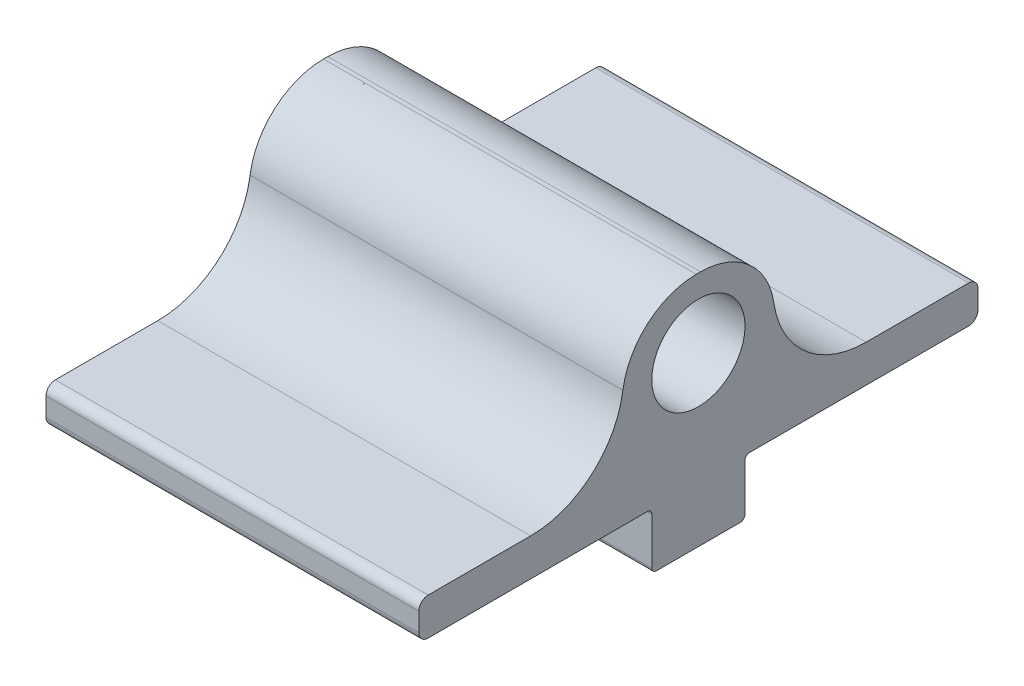
ISO-10303-21;
HEADER;
FILE_DESCRIPTION(('STEP AP214'),'2;1');
FILE_NAME('part.step','',(''),(''),'','','');
FILE_SCHEMA(('AUTOMOTIVE_DESIGN { 1 0 10303 214 1 1 1 1 }'));
ENDSEC;
DATA;
#1=APPLICATION_CONTEXT('core data for automotive mechanical design processes');
#2=APPLICATION_PROTOCOL_DEFINITION('international standard','automotive_design',2000,#1);
#3=PRODUCT_CONTEXT('',#1,'mechanical');
#4=PRODUCT('Part','Part','',(#3));
#5=PRODUCT_RELATED_PRODUCT_CATEGORY('part','',(#4));
#6=PRODUCT_DEFINITION_FORMATION('','',#4);
#7=PRODUCT_DEFINITION_CONTEXT('part definition',#1,'design');
#8=PRODUCT_DEFINITION('design','',#6,#7);
#9=PRODUCT_DEFINITION_SHAPE('','',#8);
#10=(LENGTH_UNIT() NAMED_UNIT(*) SI_UNIT(.MILLI.,.METRE.));
#11=(NAMED_UNIT(*) PLANE_ANGLE_UNIT() SI_UNIT($,.RADIAN.));
#12=(NAMED_UNIT(*) SI_UNIT($,.STERADIAN.) SOLID_ANGLE_UNIT());
#13=UNCERTAINTY_MEASURE_WITH_UNIT(LENGTH_MEASURE(1.E-05),#10,'distance_accuracy_value','');
#14=(GEOMETRIC_REPRESENTATION_CONTEXT(3) GLOBAL_UNCERTAINTY_ASSIGNED_CONTEXT((#13)) GLOBAL_UNIT_ASSIGNED_CONTEXT((#10,
#11,#12)) REPRESENTATION_CONTEXT('',''));
#15=CARTESIAN_POINT('',(0.,0.,0.));
#16=DIRECTION('',(0.,0.,1.));
#17=DIRECTION('',(1.,0.,0.));
#18=AXIS2_PLACEMENT_3D('',#15,#16,#17);
#19=CARTESIAN_POINT('',(20.,29.,30.));
#20=DIRECTION('',(-1.,0.,0.));
#21=DIRECTION('',(0.,0.,1.));
#22=AXIS2_PLACEMENT_3D('',#19,#20,#21);
#23=PLANE('',#22);
#24=CARTESIAN_POINT('',(20.,17.,0.));
#25=DIRECTION('',(-1.,0.,0.));
#26=DIRECTION('',(0.,0.,1.));
#27=AXIS2_PLACEMENT_3D('',#24,#25,#26);
#28=CIRCLE('',#27,5.);
#29=CARTESIAN_POINT('',(20.,17.,5.));
#30=VERTEX_POINT('',#29);
#31=EDGE_CURVE('E518',#30,#30,#28,.T.);
#32=ORIENTED_EDGE('',*,*,#31,.T.);
#33=EDGE_LOOP('',(#32));
#34=FACE_BOUND('',#33,.T.);
#35=DIRECTION('',(0.,0.,1.));
#36=VECTOR('',#35,1.);
#37=CARTESIAN_POINT('',(20.,-1.,-5.));
#38=LINE('',#37,#36);
#39=CARTESIAN_POINT('',(20.,-1.,-4.5));
#40=VERTEX_POINT('',#39);
#41=CARTESIAN_POINT('',(20.,-1.,4.5));
#42=VERTEX_POINT('',#41);
#43=EDGE_CURVE('E424',#40,#42,#38,.T.);
#44=ORIENTED_EDGE('',*,*,#43,.F.);
#45=CARTESIAN_POINT('',(20.,-0.5,-4.5));
#46=DIRECTION('',(-1.,0.,0.));
#47=DIRECTION('',(0.,0.,1.));
#48=AXIS2_PLACEMENT_3D('',#45,#46,#47);
#49=CIRCLE('',#48,0.5);
#50=CARTESIAN_POINT('',(20.,-0.5,-5.));
#51=VERTEX_POINT('',#50);
#52=EDGE_CURVE('E338',#40,#51,#49,.F.);
#53=ORIENTED_EDGE('',*,*,#52,.T.);
#54=DIRECTION('',(0.,1.,0.));
#55=VECTOR('',#54,1.);
#56=CARTESIAN_POINT('',(20.,-1.,-5.));
#57=LINE('',#56,#55);
#58=CARTESIAN_POINT('',(20.,4.5,-5.));
#59=VERTEX_POINT('',#58);
#60=EDGE_CURVE('E379',#51,#59,#57,.T.);
#61=ORIENTED_EDGE('',*,*,#60,.T.);
#62=CARTESIAN_POINT('',(20.,4.5,-5.5));
#63=DIRECTION('',(-1.,0.,0.));
#64=DIRECTION('',(0.,0.,1.));
#65=AXIS2_PLACEMENT_3D('',#62,#63,#64);
#66=CIRCLE('',#65,0.5);
#67=CARTESIAN_POINT('',(20.,5.,-5.5));
#68=VERTEX_POINT('',#67);
#69=EDGE_CURVE('E356',#59,#68,#66,.T.);
#70=ORIENTED_EDGE('',*,*,#69,.T.);
#71=DIRECTION('',(0.,0.,-1.));
#72=VECTOR('',#71,1.);
#73=CARTESIAN_POINT('',(20.,5.,30.));
#74=LINE('',#73,#72);
#75=CARTESIAN_POINT('',(20.,5.,-29.));
#76=VERTEX_POINT('',#75);
#77=EDGE_CURVE('E385',#68,#76,#74,.T.);
#78=ORIENTED_EDGE('',*,*,#77,.T.);
#79=CARTESIAN_POINT('',(20.,6.,-29.));
#80=DIRECTION('',(-1.,0.,0.));
#81=DIRECTION('',(0.,0.,1.));
#82=AXIS2_PLACEMENT_3D('',#79,#80,#81);
#83=CIRCLE('',#82,1.);
#84=CARTESIAN_POINT('',(20.,6.,-30.));
#85=VERTEX_POINT('',#84);
#86=EDGE_CURVE('E272',#76,#85,#83,.F.);
#87=ORIENTED_EDGE('',*,*,#86,.T.);
#88=DIRECTION('',(0.,-1.,0.));
#89=VECTOR('',#88,1.);
#90=CARTESIAN_POINT('',(20.,29.,-30.));
#91=LINE('',#90,#89);
#92=CARTESIAN_POINT('',(20.,8.,-30.));
#93=VERTEX_POINT('',#92);
#94=EDGE_CURVE('E220',#93,#85,#91,.T.);
#95=ORIENTED_EDGE('',*,*,#94,.F.);
#96=CARTESIAN_POINT('',(20.,8.,-29.));
#97=DIRECTION('',(-1.,0.,0.));
#98=DIRECTION('',(0.,0.,1.));
#99=AXIS2_PLACEMENT_3D('',#96,#97,#98);
#100=CIRCLE('',#99,1.);
#101=CARTESIAN_POINT('',(20.,9.,-29.));
#102=VERTEX_POINT('',#101);
#103=EDGE_CURVE('E269',#93,#102,#100,.F.);
#104=ORIENTED_EDGE('',*,*,#103,.T.);
#105=DIRECTION('',(0.,0.,1.));
#106=VECTOR('',#105,1.);
#107=CARTESIAN_POINT('',(20.,9.,30.));
#108=LINE('',#107,#106);
#109=CARTESIAN_POINT('',(20.,9.,-18.));
#110=VERTEX_POINT('',#109);
#111=EDGE_CURVE('E422',#102,#110,#108,.T.);
#112=ORIENTED_EDGE('',*,*,#111,.T.);
#113=CARTESIAN_POINT('',(20.,19.,-18.));
#114=DIRECTION('',(-1.,0.,0.));
#115=DIRECTION('',(0.,0.,1.));
#116=AXIS2_PLACEMENT_3D('',#113,#114,#115);
#117=CIRCLE('',#116,10.);
#118=CARTESIAN_POINT('',(20.,17.5699498710105,-8.10278035867763));
#119=VERTEX_POINT('',#118);
#120=EDGE_CURVE('E201',#110,#119,#117,.T.);
#121=ORIENTED_EDGE('',*,*,#120,.T.);
#122=CARTESIAN_POINT('',(20.,16.425909767819,-0.185004645619741));
#123=DIRECTION('',(-1.,0.,0.));
#124=DIRECTION('',(0.,0.,1.));
#125=AXIS2_PLACEMENT_3D('',#122,#123,#124);
#126=CIRCLE('',#125,8.);
#127=CARTESIAN_POINT('',(20.,24.4257942510587,-0.227995979873574));
#128=VERTEX_POINT('',#127);
#129=EDGE_CURVE('E310',#119,#128,#126,.F.);
#130=ORIENTED_EDGE('',*,*,#129,.T.);
#131=CARTESIAN_POINT('',(20.,-18.,0.));
#132=DIRECTION('',(-1.,0.,0.));
#133=DIRECTION('',(0.,0.,1.));
#134=AXIS2_PLACEMENT_3D('',#131,#132,#133);
#135=CIRCLE('',#134,42.4264068711928);
#136=CARTESIAN_POINT('',(20.,24.4257942510587,0.227995979873576));
#137=VERTEX_POINT('',#136);
#138=EDGE_CURVE('E398',#137,#128,#135,.T.);
#139=ORIENTED_EDGE('',*,*,#138,.F.);
#140=CARTESIAN_POINT('',(20.,16.425909767819,0.185004645619742));
#141=DIRECTION('',(-1.,0.,0.));
#142=DIRECTION('',(0.,0.,1.));
#143=AXIS2_PLACEMENT_3D('',#140,#141,#142);
#144=CIRCLE('',#143,8.);
#145=CARTESIAN_POINT('',(20.,17.5699498710105,8.10278035867763));
#146=VERTEX_POINT('',#145);
#147=EDGE_CURVE('E307',#137,#146,#144,.F.);
#148=ORIENTED_EDGE('',*,*,#147,.T.);
#149=CARTESIAN_POINT('',(20.,19.,18.));
#150=DIRECTION('',(-1.,0.,0.));
#151=DIRECTION('',(0.,0.,1.));
#152=AXIS2_PLACEMENT_3D('',#149,#150,#151);
#153=CIRCLE('',#152,10.);
#154=CARTESIAN_POINT('',(20.,9.,18.));
#155=VERTEX_POINT('',#154);
#156=EDGE_CURVE('E237',#146,#155,#153,.T.);
#157=ORIENTED_EDGE('',*,*,#156,.T.);
#158=DIRECTION('',(0.,0.,-1.));
#159=VECTOR('',#158,1.);
#160=CARTESIAN_POINT('',(20.,8.99999999999999,30.));
#161=LINE('',#160,#159);
#162=CARTESIAN_POINT('',(20.,8.99999999999999,29.));
#163=VERTEX_POINT('',#162);
#164=EDGE_CURVE('E214',#163,#155,#161,.T.);
#165=ORIENTED_EDGE('',*,*,#164,.F.);
#166=CARTESIAN_POINT('',(20.,7.99999999999999,29.));
#167=DIRECTION('',(-1.,0.,0.));
#168=DIRECTION('',(0.,0.,1.));
#169=AXIS2_PLACEMENT_3D('',#166,#167,#168);
#170=CIRCLE('',#169,1.);
#171=CARTESIAN_POINT('',(20.,7.99999999999999,30.));
#172=VERTEX_POINT('',#171);
#173=EDGE_CURVE('E263',#163,#172,#170,.F.);
#174=ORIENTED_EDGE('',*,*,#173,.T.);
#175=DIRECTION('',(0.,-1.,0.));
#176=VECTOR('',#175,1.);
#177=CARTESIAN_POINT('',(20.,29.,30.));
#178=LINE('',#177,#176);
#179=CARTESIAN_POINT('',(20.,6.,30.));
#180=VERTEX_POINT('',#179);
#181=EDGE_CURVE('E404',#172,#180,#178,.T.);
#182=ORIENTED_EDGE('',*,*,#181,.T.);
#183=CARTESIAN_POINT('',(20.,6.,29.));
#184=DIRECTION('',(-1.,0.,0.));
#185=DIRECTION('',(0.,0.,1.));
#186=AXIS2_PLACEMENT_3D('',#183,#184,#185);
#187=CIRCLE('',#186,1.);
#188=CARTESIAN_POINT('',(20.,5.,29.));
#189=VERTEX_POINT('',#188);
#190=EDGE_CURVE('E266',#180,#189,#187,.F.);
#191=ORIENTED_EDGE('',*,*,#190,.T.);
#192=CARTESIAN_POINT('',(20.,5.,5.5));
#193=VERTEX_POINT('',#192);
#194=EDGE_CURVE('E391',#189,#193,#74,.T.);
#195=ORIENTED_EDGE('',*,*,#194,.T.);
#196=CARTESIAN_POINT('',(20.,4.5,5.5));
#197=DIRECTION('',(-1.,0.,0.));
#198=DIRECTION('',(0.,0.,1.));
#199=AXIS2_PLACEMENT_3D('',#196,#197,#198);
#200=CIRCLE('',#199,0.5);
#201=CARTESIAN_POINT('',(20.,4.5,5.));
#202=VERTEX_POINT('',#201);
#203=EDGE_CURVE('E11',#193,#202,#200,.T.);
#204=ORIENTED_EDGE('',*,*,#203,.T.);
#205=DIRECTION('',(0.,1.,0.));
#206=VECTOR('',#205,1.);
#207=CARTESIAN_POINT('',(20.,-1.,5.));
#208=LINE('',#207,#206);
#209=CARTESIAN_POINT('',(20.,-0.5,5.));
#210=VERTEX_POINT('',#209);
#211=EDGE_CURVE('E442',#210,#202,#208,.T.);
#212=ORIENTED_EDGE('',*,*,#211,.F.);
#213=CARTESIAN_POINT('',(20.,-0.5,4.5));
#214=DIRECTION('',(-1.,0.,0.));
#215=DIRECTION('',(0.,0.,1.));
#216=AXIS2_PLACEMENT_3D('',#213,#214,#215);
#217=CIRCLE('',#216,0.5);
#218=EDGE_CURVE('E335',#210,#42,#217,.F.);
#219=ORIENTED_EDGE('',*,*,#218,.T.);
#220=EDGE_LOOP('',(#44,#53,#61,#70,#78,#87,#95,#104,#112,#121,#130,#139,#148,#157,#165,#174,
#182,#191,#195,#204,#212,#219));
#221=FACE_BOUND('',#220,.T.);
#222=ADVANCED_FACE('F43',(#34,#221),#23,.F.);
#223=CARTESIAN_POINT('',(-20.,29.,30.));
#224=DIRECTION('',(1.,0.,0.));
#225=DIRECTION('',(0.,0.,-1.));
#226=AXIS2_PLACEMENT_3D('',#223,#224,#225);
#227=PLANE('',#226);
#228=CARTESIAN_POINT('',(-20.,17.,0.));
#229=DIRECTION('',(1.,0.,0.));
#230=DIRECTION('',(0.,0.,-1.));
#231=AXIS2_PLACEMENT_3D('',#228,#229,#230);
#232=CIRCLE('',#231,5.);
#233=CARTESIAN_POINT('',(-20.,17.,-5.));
#234=VERTEX_POINT('',#233);
#235=EDGE_CURVE('E520',#234,#234,#232,.T.);
#236=ORIENTED_EDGE('',*,*,#235,.T.);
#237=EDGE_LOOP('',(#236));
#238=FACE_BOUND('',#237,.T.);
#239=DIRECTION('',(0.,1.,0.));
#240=VECTOR('',#239,1.);
#241=CARTESIAN_POINT('',(-20.,-1.,-5.));
#242=LINE('',#241,#240);
#243=CARTESIAN_POINT('',(-20.,-0.5,-5.));
#244=VERTEX_POINT('',#243);
#245=CARTESIAN_POINT('',(-20.,4.5,-5.));
#246=VERTEX_POINT('',#245);
#247=EDGE_CURVE('E365',#244,#246,#242,.T.);
#248=ORIENTED_EDGE('',*,*,#247,.F.);
#249=CARTESIAN_POINT('',(-20.,-0.5,-4.5));
#250=DIRECTION('',(1.,0.,0.));
#251=DIRECTION('',(0.,0.,-1.));
#252=AXIS2_PLACEMENT_3D('',#249,#250,#251);
#253=CIRCLE('',#252,0.5);
#254=CARTESIAN_POINT('',(-20.,-1.,-4.5));
#255=VERTEX_POINT('',#254);
#256=EDGE_CURVE('E344',#244,#255,#253,.F.);
#257=ORIENTED_EDGE('',*,*,#256,.T.);
#258=DIRECTION('',(0.,0.,-1.));
#259=VECTOR('',#258,1.);
#260=CARTESIAN_POINT('',(-20.,-1.,-5.));
#261=LINE('',#260,#259);
#262=CARTESIAN_POINT('',(-20.,-1.,4.5));
#263=VERTEX_POINT('',#262);
#264=EDGE_CURVE('E429',#263,#255,#261,.T.);
#265=ORIENTED_EDGE('',*,*,#264,.F.);
#266=CARTESIAN_POINT('',(-20.,-0.5,4.5));
#267=DIRECTION('',(1.,0.,0.));
#268=DIRECTION('',(0.,0.,-1.));
#269=AXIS2_PLACEMENT_3D('',#266,#267,#268);
#270=CIRCLE('',#269,0.5);
#271=CARTESIAN_POINT('',(-20.,-0.5,5.));
#272=VERTEX_POINT('',#271);
#273=EDGE_CURVE('E341',#263,#272,#270,.F.);
#274=ORIENTED_EDGE('',*,*,#273,.T.);
#275=DIRECTION('',(0.,1.,0.));
#276=VECTOR('',#275,1.);
#277=CARTESIAN_POINT('',(-20.,-1.,5.));
#278=LINE('',#277,#276);
#279=CARTESIAN_POINT('',(-20.,4.5,5.));
#280=VERTEX_POINT('',#279);
#281=EDGE_CURVE('E378',#272,#280,#278,.T.);
#282=ORIENTED_EDGE('',*,*,#281,.T.);
#283=CARTESIAN_POINT('',(-20.,4.5,5.5));
#284=DIRECTION('',(1.,0.,0.));
#285=DIRECTION('',(0.,0.,-1.));
#286=AXIS2_PLACEMENT_3D('',#283,#284,#285);
#287=CIRCLE('',#286,0.5);
#288=CARTESIAN_POINT('',(-20.,5.,5.5));
#289=VERTEX_POINT('',#288);
#290=EDGE_CURVE('E52',#280,#289,#287,.T.);
#291=ORIENTED_EDGE('',*,*,#290,.T.);
#292=DIRECTION('',(0.,0.,1.));
#293=VECTOR('',#292,1.);
#294=CARTESIAN_POINT('',(-20.,5.,30.));
#295=LINE('',#294,#293);
#296=CARTESIAN_POINT('',(-20.,5.,29.));
#297=VERTEX_POINT('',#296);
#298=EDGE_CURVE('E397',#289,#297,#295,.T.);
#299=ORIENTED_EDGE('',*,*,#298,.T.);
#300=CARTESIAN_POINT('',(-20.,6.,29.));
#301=DIRECTION('',(1.,0.,0.));
#302=DIRECTION('',(0.,0.,-1.));
#303=AXIS2_PLACEMENT_3D('',#300,#301,#302);
#304=CIRCLE('',#303,1.);
#305=CARTESIAN_POINT('',(-20.,6.,30.));
#306=VERTEX_POINT('',#305);
#307=EDGE_CURVE('E250',#297,#306,#304,.F.);
#308=ORIENTED_EDGE('',*,*,#307,.T.);
#309=DIRECTION('',(0.,-1.,0.));
#310=VECTOR('',#309,1.);
#311=CARTESIAN_POINT('',(-20.,29.,30.));
#312=LINE('',#311,#310);
#313=CARTESIAN_POINT('',(-20.,7.99999999999999,30.));
#314=VERTEX_POINT('',#313);
#315=EDGE_CURVE('E408',#314,#306,#312,.T.);
#316=ORIENTED_EDGE('',*,*,#315,.F.);
#317=CARTESIAN_POINT('',(-20.,7.99999999999999,29.));
#318=DIRECTION('',(1.,0.,0.));
#319=DIRECTION('',(0.,0.,-1.));
#320=AXIS2_PLACEMENT_3D('',#317,#318,#319);
#321=CIRCLE('',#320,1.);
#322=CARTESIAN_POINT('',(-20.,8.99999999999999,29.));
#323=VERTEX_POINT('',#322);
#324=EDGE_CURVE('E247',#314,#323,#321,.F.);
#325=ORIENTED_EDGE('',*,*,#324,.T.);
#326=DIRECTION('',(0.,0.,-1.));
#327=VECTOR('',#326,1.);
#328=CARTESIAN_POINT('',(-20.,9.,0.));
#329=LINE('',#328,#327);
#330=CARTESIAN_POINT('',(-20.,9.,18.));
#331=VERTEX_POINT('',#330);
#332=EDGE_CURVE('E215',#323,#331,#329,.T.);
#333=ORIENTED_EDGE('',*,*,#332,.T.);
#334=CARTESIAN_POINT('',(-20.,19.,18.));
#335=DIRECTION('',(1.,0.,0.));
#336=DIRECTION('',(0.,0.,-1.));
#337=AXIS2_PLACEMENT_3D('',#334,#335,#336);
#338=CIRCLE('',#337,10.);
#339=CARTESIAN_POINT('',(-20.,17.5699498710105,8.10278035867763));
#340=VERTEX_POINT('',#339);
#341=EDGE_CURVE('E233',#331,#340,#338,.T.);
#342=ORIENTED_EDGE('',*,*,#341,.T.);
#343=CARTESIAN_POINT('',(-20.,16.425909767819,0.185004645619742));
#344=DIRECTION('',(1.,0.,0.));
#345=DIRECTION('',(0.,0.,-1.));
#346=AXIS2_PLACEMENT_3D('',#343,#344,#345);
#347=CIRCLE('',#346,8.);
#348=CARTESIAN_POINT('',(-20.,24.4257942510587,0.227995979873576));
#349=VERTEX_POINT('',#348);
#350=EDGE_CURVE('E299',#340,#349,#347,.F.);
#351=ORIENTED_EDGE('',*,*,#350,.T.);
#352=CARTESIAN_POINT('',(-20.,-18.,0.));
#353=DIRECTION('',(1.,0.,0.));
#354=DIRECTION('',(0.,0.,-1.));
#355=AXIS2_PLACEMENT_3D('',#352,#353,#354);
#356=CIRCLE('',#355,42.4264068711928);
#357=CARTESIAN_POINT('',(-20.,24.4257942510587,-0.227995979873574));
#358=VERTEX_POINT('',#357);
#359=EDGE_CURVE('E392',#349,#358,#356,.F.);
#360=ORIENTED_EDGE('',*,*,#359,.T.);
#361=CARTESIAN_POINT('',(-20.,16.425909767819,-0.185004645619741));
#362=DIRECTION('',(1.,0.,0.));
#363=DIRECTION('',(0.,0.,-1.));
#364=AXIS2_PLACEMENT_3D('',#361,#362,#363);
#365=CIRCLE('',#364,8.);
#366=CARTESIAN_POINT('',(-20.,17.5699498710105,-8.10278035867763));
#367=VERTEX_POINT('',#366);
#368=EDGE_CURVE('E196',#358,#367,#365,.F.);
#369=ORIENTED_EDGE('',*,*,#368,.T.);
#370=CARTESIAN_POINT('',(-20.,19.,-18.));
#371=DIRECTION('',(1.,0.,0.));
#372=DIRECTION('',(0.,0.,-1.));
#373=AXIS2_PLACEMENT_3D('',#370,#371,#372);
#374=CIRCLE('',#373,10.);
#375=CARTESIAN_POINT('',(-20.,9.,-18.));
#376=VERTEX_POINT('',#375);
#377=EDGE_CURVE('E190',#367,#376,#374,.T.);
#378=ORIENTED_EDGE('',*,*,#377,.T.);
#379=DIRECTION('',(0.,0.,1.));
#380=VECTOR('',#379,1.);
#381=CARTESIAN_POINT('',(-20.,9.,0.));
#382=LINE('',#381,#380);
#383=CARTESIAN_POINT('',(-20.,9.,-29.));
#384=VERTEX_POINT('',#383);
#385=EDGE_CURVE('E194',#384,#376,#382,.T.);
#386=ORIENTED_EDGE('',*,*,#385,.F.);
#387=CARTESIAN_POINT('',(-20.,8.,-29.));
#388=DIRECTION('',(1.,0.,0.));
#389=DIRECTION('',(0.,0.,-1.));
#390=AXIS2_PLACEMENT_3D('',#387,#388,#389);
#391=CIRCLE('',#390,1.);
#392=CARTESIAN_POINT('',(-20.,8.,-30.));
#393=VERTEX_POINT('',#392);
#394=EDGE_CURVE('E253',#384,#393,#391,.F.);
#395=ORIENTED_EDGE('',*,*,#394,.T.);
#396=DIRECTION('',(0.,-1.,0.));
#397=VECTOR('',#396,1.);
#398=CARTESIAN_POINT('',(-20.,29.,-30.));
#399=LINE('',#398,#397);
#400=CARTESIAN_POINT('',(-20.,6.,-30.));
#401=VERTEX_POINT('',#400);
#402=EDGE_CURVE('E227',#393,#401,#399,.T.);
#403=ORIENTED_EDGE('',*,*,#402,.T.);
#404=CARTESIAN_POINT('',(-20.,6.,-29.));
#405=DIRECTION('',(1.,0.,0.));
#406=DIRECTION('',(0.,0.,-1.));
#407=AXIS2_PLACEMENT_3D('',#404,#405,#406);
#408=CIRCLE('',#407,1.);
#409=CARTESIAN_POINT('',(-20.,5.,-29.));
#410=VERTEX_POINT('',#409);
#411=EDGE_CURVE('E256',#401,#410,#408,.F.);
#412=ORIENTED_EDGE('',*,*,#411,.T.);
#413=CARTESIAN_POINT('',(-20.,5.,-5.5));
#414=VERTEX_POINT('',#413);
#415=EDGE_CURVE('E368',#410,#414,#295,.T.);
#416=ORIENTED_EDGE('',*,*,#415,.T.);
#417=CARTESIAN_POINT('',(-20.,4.5,-5.5));
#418=DIRECTION('',(1.,0.,0.));
#419=DIRECTION('',(0.,0.,-1.));
#420=AXIS2_PLACEMENT_3D('',#417,#418,#419);
#421=CIRCLE('',#420,0.5);
#422=EDGE_CURVE('E359',#414,#246,#421,.T.);
#423=ORIENTED_EDGE('',*,*,#422,.T.);
#424=EDGE_LOOP('',(#248,#257,#265,#274,#282,#291,#299,#308,#316,#325,#333,#342,#351,#360,#369,
#378,#386,#395,#403,#412,#416,#423));
#425=FACE_BOUND('',#424,.T.);
#426=ADVANCED_FACE('F193',(#238,#425),#227,.F.);
#427=CARTESIAN_POINT('',(-20.,29.,30.));
#428=DIRECTION('',(0.,0.,-1.));
#429=DIRECTION('',(-1.,0.,0.));
#430=AXIS2_PLACEMENT_3D('',#427,#428,#429);
#431=PLANE('',#430);
#432=ORIENTED_EDGE('',*,*,#315,.T.);
#433=DIRECTION('',(1.,0.,0.));
#434=VECTOR('',#433,1.);
#435=CARTESIAN_POINT('',(-20.,6.,30.));
#436=LINE('',#435,#434);
#437=EDGE_CURVE('E281',#306,#180,#436,.T.);
#438=ORIENTED_EDGE('',*,*,#437,.T.);
#439=ORIENTED_EDGE('',*,*,#181,.F.);
#440=DIRECTION('',(-1.,0.,0.));
#441=VECTOR('',#440,1.);
#442=CARTESIAN_POINT('',(-20.,7.99999999999999,30.));
#443=LINE('',#442,#441);
#444=EDGE_CURVE('E277',#172,#314,#443,.T.);
#445=ORIENTED_EDGE('',*,*,#444,.T.);
#446=EDGE_LOOP('',(#432,#438,#439,#445));
#447=FACE_BOUND('',#446,.T.);
#448=ADVANCED_FACE('F477',(#447),#431,.F.);
#449=CARTESIAN_POINT('',(-40.,-18.,0.));
#450=DIRECTION('',(1.,0.,0.));
#451=DIRECTION('',(0.,0.,-1.));
#452=AXIS2_PLACEMENT_3D('',#449,#450,#451);
#453=CYLINDRICAL_SURFACE('',#452,42.4264068711928);
#454=ORIENTED_EDGE('',*,*,#138,.T.);
#455=DIRECTION('',(1.,0.,0.));
#456=VECTOR('',#455,1.);
#457=CARTESIAN_POINT('',(-40.,24.4257942510587,-0.227995979873574));
#458=LINE('',#457,#456);
#459=EDGE_CURVE('E295',#128,#358,#458,.F.);
#460=ORIENTED_EDGE('',*,*,#459,.T.);
#461=ORIENTED_EDGE('',*,*,#359,.F.);
#462=DIRECTION('',(1.,0.,0.));
#463=VECTOR('',#462,1.);
#464=CARTESIAN_POINT('',(-40.,24.4257942510587,0.227995979873576));
#465=LINE('',#464,#463);
#466=EDGE_CURVE('E292',#349,#137,#465,.T.);
#467=ORIENTED_EDGE('',*,*,#466,.T.);
#468=EDGE_LOOP('',(#454,#460,#461,#467));
#469=FACE_BOUND('',#468,.T.);
#470=ADVANCED_FACE('F450',(#469),#453,.T.);
#471=CARTESIAN_POINT('',(40.,5.,55.));
#472=DIRECTION('',(0.,1.,0.));
#473=DIRECTION('',(0.,0.,1.));
#474=AXIS2_PLACEMENT_3D('',#471,#472,#473);
#475=PLANE('',#474);
#476=ORIENTED_EDGE('',*,*,#77,.F.);
#477=DIRECTION('',(1.,0.,0.));
#478=VECTOR('',#477,1.);
#479=CARTESIAN_POINT('',(-20.,5.,-5.5));
#480=LINE('',#479,#478);
#481=EDGE_CURVE('E324',#68,#414,#480,.F.);
#482=ORIENTED_EDGE('',*,*,#481,.T.);
#483=ORIENTED_EDGE('',*,*,#415,.F.);
#484=DIRECTION('',(-1.,0.,0.));
#485=VECTOR('',#484,1.);
#486=CARTESIAN_POINT('',(40.,5.,-29.));
#487=LINE('',#486,#485);
#488=EDGE_CURVE('E259',#410,#76,#487,.F.);
#489=ORIENTED_EDGE('',*,*,#488,.T.);
#490=EDGE_LOOP('',(#476,#482,#483,#489));
#491=FACE_BOUND('',#490,.T.);
#492=ADVANCED_FACE('F387',(#491),#475,.F.);
#493=ORIENTED_EDGE('',*,*,#298,.F.);
#494=DIRECTION('',(-1.,0.,0.));
#495=VECTOR('',#494,1.);
#496=CARTESIAN_POINT('',(20.,5.,5.5));
#497=LINE('',#496,#495);
#498=EDGE_CURVE('E353',#289,#193,#497,.F.);
#499=ORIENTED_EDGE('',*,*,#498,.T.);
#500=ORIENTED_EDGE('',*,*,#194,.F.);
#501=DIRECTION('',(1.,0.,0.));
#502=VECTOR('',#501,1.);
#503=CARTESIAN_POINT('',(40.,5.,29.));
#504=LINE('',#503,#502);
#505=EDGE_CURVE('E285',#189,#297,#504,.F.);
#506=ORIENTED_EDGE('',*,*,#505,.T.);
#507=EDGE_LOOP('',(#493,#499,#500,#506));
#508=FACE_BOUND('',#507,.T.);
#509=ADVANCED_FACE('F485',(#508),#475,.F.);
#510=CARTESIAN_POINT('',(-20.,29.,-30.));
#511=DIRECTION('',(0.,0.,1.));
#512=DIRECTION('',(1.,0.,0.));
#513=AXIS2_PLACEMENT_3D('',#510,#511,#512);
#514=PLANE('',#513);
#515=ORIENTED_EDGE('',*,*,#94,.T.);
#516=DIRECTION('',(-1.,0.,0.));
#517=VECTOR('',#516,1.);
#518=CARTESIAN_POINT('',(-20.,6.,-30.));
#519=LINE('',#518,#517);
#520=EDGE_CURVE('E243',#85,#401,#519,.T.);
#521=ORIENTED_EDGE('',*,*,#520,.T.);
#522=ORIENTED_EDGE('',*,*,#402,.F.);
#523=DIRECTION('',(-1.,0.,0.));
#524=VECTOR('',#523,1.);
#525=CARTESIAN_POINT('',(-20.,8.,-30.));
#526=LINE('',#525,#524);
#527=EDGE_CURVE('E240',#393,#93,#526,.F.);
#528=ORIENTED_EDGE('',*,*,#527,.T.);
#529=EDGE_LOOP('',(#515,#521,#522,#528));
#530=FACE_BOUND('',#529,.T.);
#531=ADVANCED_FACE('F416',(#530),#514,.F.);
#532=CARTESIAN_POINT('',(-20.,-1.,5.));
#533=DIRECTION('',(0.,0.,-1.));
#534=DIRECTION('',(-1.,0.,0.));
#535=AXIS2_PLACEMENT_3D('',#532,#533,#534);
#536=PLANE('',#535);
#537=ORIENTED_EDGE('',*,*,#281,.F.);
#538=DIRECTION('',(-1.,0.,0.));
#539=VECTOR('',#538,1.);
#540=CARTESIAN_POINT('',(-20.,-0.5,5.));
#541=LINE('',#540,#539);
#542=EDGE_CURVE('E350',#272,#210,#541,.F.);
#543=ORIENTED_EDGE('',*,*,#542,.T.);
#544=ORIENTED_EDGE('',*,*,#211,.T.);
#545=DIRECTION('',(-1.,0.,0.));
#546=VECTOR('',#545,1.);
#547=CARTESIAN_POINT('',(-20.,4.5,5.));
#548=LINE('',#547,#546);
#549=EDGE_CURVE('E347',#202,#280,#548,.T.);
#550=ORIENTED_EDGE('',*,*,#549,.T.);
#551=EDGE_LOOP('',(#537,#543,#544,#550));
#552=FACE_BOUND('',#551,.T.);
#553=ADVANCED_FACE('F547',(#552),#536,.F.);
#554=CARTESIAN_POINT('',(-20.,-1.,-5.));
#555=DIRECTION('',(0.,0.,1.));
#556=DIRECTION('',(1.,0.,0.));
#557=AXIS2_PLACEMENT_3D('',#554,#555,#556);
#558=PLANE('',#557);
#559=ORIENTED_EDGE('',*,*,#247,.T.);
#560=DIRECTION('',(1.,0.,0.));
#561=VECTOR('',#560,1.);
#562=CARTESIAN_POINT('',(20.,4.5,-5.));
#563=LINE('',#562,#561);
#564=EDGE_CURVE('E320',#246,#59,#563,.T.);
#565=ORIENTED_EDGE('',*,*,#564,.T.);
#566=ORIENTED_EDGE('',*,*,#60,.F.);
#567=DIRECTION('',(1.,0.,0.));
#568=VECTOR('',#567,1.);
#569=CARTESIAN_POINT('',(-20.,-0.5,-5.));
#570=LINE('',#569,#568);
#571=EDGE_CURVE('E317',#51,#244,#570,.F.);
#572=ORIENTED_EDGE('',*,*,#571,.T.);
#573=EDGE_LOOP('',(#559,#565,#566,#572));
#574=FACE_BOUND('',#573,.T.);
#575=ADVANCED_FACE('F373',(#574),#558,.F.);
#576=CARTESIAN_POINT('',(0.,-1.,0.));
#577=DIRECTION('',(0.,1.,0.));
#578=DIRECTION('',(0.,0.,1.));
#579=AXIS2_PLACEMENT_3D('',#576,#577,#578);
#580=PLANE('',#579);
#581=ORIENTED_EDGE('',*,*,#264,.T.);
#582=DIRECTION('',(1.,0.,0.));
#583=VECTOR('',#582,1.);
#584=CARTESIAN_POINT('',(0.,-1.,-4.5));
#585=LINE('',#584,#583);
#586=EDGE_CURVE('E331',#255,#40,#585,.T.);
#587=ORIENTED_EDGE('',*,*,#586,.T.);
#588=ORIENTED_EDGE('',*,*,#43,.T.);
#589=DIRECTION('',(-1.,0.,0.));
#590=VECTOR('',#589,1.);
#591=CARTESIAN_POINT('',(0.,-1.,4.5));
#592=LINE('',#591,#590);
#593=EDGE_CURVE('E327',#42,#263,#592,.T.);
#594=ORIENTED_EDGE('',*,*,#593,.T.);
#595=EDGE_LOOP('',(#581,#587,#588,#594));
#596=FACE_BOUND('',#595,.T.);
#597=ADVANCED_FACE('F541',(#596),#580,.F.);
#598=CARTESIAN_POINT('',(30.,9.,0.));
#599=DIRECTION('',(0.,1.,0.));
#600=DIRECTION('',(0.,0.,1.));
#601=AXIS2_PLACEMENT_3D('',#598,#599,#600);
#602=PLANE('',#601);
#603=ORIENTED_EDGE('',*,*,#332,.F.);
#604=DIRECTION('',(-1.,0.,0.));
#605=VECTOR('',#604,1.);
#606=CARTESIAN_POINT('',(20.,8.99999999999999,29.));
#607=LINE('',#606,#605);
#608=EDGE_CURVE('E289',#323,#163,#607,.F.);
#609=ORIENTED_EDGE('',*,*,#608,.T.);
#610=ORIENTED_EDGE('',*,*,#164,.T.);
#611=DIRECTION('',(-1.,0.,0.));
#612=VECTOR('',#611,1.);
#613=CARTESIAN_POINT('',(-20.,9.,18.));
#614=LINE('',#613,#612);
#615=EDGE_CURVE('E202',#155,#331,#614,.T.);
#616=ORIENTED_EDGE('',*,*,#615,.T.);
#617=EDGE_LOOP('',(#603,#609,#610,#616));
#618=FACE_BOUND('',#617,.T.);
#619=ADVANCED_FACE('F514',(#618),#602,.T.);
#620=CARTESIAN_POINT('',(30.,9.,0.));
#621=DIRECTION('',(0.,-1.,0.));
#622=DIRECTION('',(0.,0.,-1.));
#623=AXIS2_PLACEMENT_3D('',#620,#621,#622);
#624=PLANE('',#623);
#625=ORIENTED_EDGE('',*,*,#111,.F.);
#626=DIRECTION('',(-1.,0.,0.));
#627=VECTOR('',#626,1.);
#628=CARTESIAN_POINT('',(30.,9.,-29.));
#629=LINE('',#628,#627);
#630=EDGE_CURVE('E212',#102,#384,#629,.T.);
#631=ORIENTED_EDGE('',*,*,#630,.T.);
#632=ORIENTED_EDGE('',*,*,#385,.T.);
#633=DIRECTION('',(-1.,0.,0.));
#634=VECTOR('',#633,1.);
#635=CARTESIAN_POINT('',(20.,9.,-18.));
#636=LINE('',#635,#634);
#637=EDGE_CURVE('E209',#376,#110,#636,.F.);
#638=ORIENTED_EDGE('',*,*,#637,.T.);
#639=EDGE_LOOP('',(#625,#631,#632,#638));
#640=FACE_BOUND('',#639,.T.);
#641=ADVANCED_FACE('F208',(#640),#624,.F.);
#642=CARTESIAN_POINT('',(30.,19.,-18.));
#643=DIRECTION('',(1.,0.,0.));
#644=DIRECTION('',(0.,0.,-1.));
#645=AXIS2_PLACEMENT_3D('',#642,#643,#644);
#646=CYLINDRICAL_SURFACE('',#645,10.);
#647=ORIENTED_EDGE('',*,*,#377,.F.);
#648=DIRECTION('',(1.,0.,0.));
#649=VECTOR('',#648,1.);
#650=CARTESIAN_POINT('',(30.,17.5699498710105,-8.10278035867763));
#651=LINE('',#650,#649);
#652=EDGE_CURVE('E304',#367,#119,#651,.T.);
#653=ORIENTED_EDGE('',*,*,#652,.T.);
#654=ORIENTED_EDGE('',*,*,#120,.F.);
#655=ORIENTED_EDGE('',*,*,#637,.F.);
#656=EDGE_LOOP('',(#647,#653,#654,#655));
#657=FACE_BOUND('',#656,.T.);
#658=ADVANCED_FACE('F217',(#657),#646,.F.);
#659=CARTESIAN_POINT('',(30.,19.,18.));
#660=DIRECTION('',(1.,0.,0.));
#661=DIRECTION('',(0.,0.,-1.));
#662=AXIS2_PLACEMENT_3D('',#659,#660,#661);
#663=CYLINDRICAL_SURFACE('',#662,10.);
#664=ORIENTED_EDGE('',*,*,#156,.F.);
#665=DIRECTION('',(1.,0.,0.));
#666=VECTOR('',#665,1.);
#667=CARTESIAN_POINT('',(30.,17.5699498710105,8.10278035867763));
#668=LINE('',#667,#666);
#669=EDGE_CURVE('E313',#146,#340,#668,.F.);
#670=ORIENTED_EDGE('',*,*,#669,.T.);
#671=ORIENTED_EDGE('',*,*,#341,.F.);
#672=ORIENTED_EDGE('',*,*,#615,.F.);
#673=EDGE_LOOP('',(#664,#670,#671,#672));
#674=FACE_BOUND('',#673,.T.);
#675=ADVANCED_FACE('F488',(#674),#663,.F.);
#676=CARTESIAN_POINT('',(-20.,6.,-29.));
#677=DIRECTION('',(-1.,0.,0.));
#678=DIRECTION('',(0.,0.,1.));
#679=AXIS2_PLACEMENT_3D('',#676,#677,#678);
#680=CYLINDRICAL_SURFACE('',#679,1.);
#681=ORIENTED_EDGE('',*,*,#86,.F.);
#682=ORIENTED_EDGE('',*,*,#488,.F.);
#683=ORIENTED_EDGE('',*,*,#411,.F.);
#684=ORIENTED_EDGE('',*,*,#520,.F.);
#685=EDGE_LOOP('',(#681,#682,#683,#684));
#686=FACE_BOUND('',#685,.T.);
#687=ADVANCED_FACE('F491',(#686),#680,.T.);
#688=CARTESIAN_POINT('',(30.,8.,-29.));
#689=DIRECTION('',(-1.,0.,0.));
#690=DIRECTION('',(0.,0.,1.));
#691=AXIS2_PLACEMENT_3D('',#688,#689,#690);
#692=CYLINDRICAL_SURFACE('',#691,1.);
#693=ORIENTED_EDGE('',*,*,#103,.F.);
#694=ORIENTED_EDGE('',*,*,#527,.F.);
#695=ORIENTED_EDGE('',*,*,#394,.F.);
#696=ORIENTED_EDGE('',*,*,#630,.F.);
#697=EDGE_LOOP('',(#693,#694,#695,#696));
#698=FACE_BOUND('',#697,.T.);
#699=ADVANCED_FACE('F421',(#698),#692,.T.);
#700=CARTESIAN_POINT('',(-20.,6.,29.));
#701=DIRECTION('',(1.,0.,0.));
#702=DIRECTION('',(0.,0.,-1.));
#703=AXIS2_PLACEMENT_3D('',#700,#701,#702);
#704=CYLINDRICAL_SURFACE('',#703,1.);
#705=ORIENTED_EDGE('',*,*,#307,.F.);
#706=ORIENTED_EDGE('',*,*,#505,.F.);
#707=ORIENTED_EDGE('',*,*,#190,.F.);
#708=ORIENTED_EDGE('',*,*,#437,.F.);
#709=EDGE_LOOP('',(#705,#706,#707,#708));
#710=FACE_BOUND('',#709,.T.);
#711=ADVANCED_FACE('F467',(#710),#704,.T.);
#712=CARTESIAN_POINT('',(-20.,7.99999999999999,29.));
#713=DIRECTION('',(1.,0.,0.));
#714=DIRECTION('',(0.,0.,-1.));
#715=AXIS2_PLACEMENT_3D('',#712,#713,#714);
#716=CYLINDRICAL_SURFACE('',#715,1.);
#717=ORIENTED_EDGE('',*,*,#173,.F.);
#718=ORIENTED_EDGE('',*,*,#608,.F.);
#719=ORIENTED_EDGE('',*,*,#324,.F.);
#720=ORIENTED_EDGE('',*,*,#444,.F.);
#721=EDGE_LOOP('',(#717,#718,#719,#720));
#722=FACE_BOUND('',#721,.T.);
#723=ADVANCED_FACE('F459',(#722),#716,.T.);
#724=CARTESIAN_POINT('',(30.,16.425909767819,-0.185004645619741));
#725=DIRECTION('',(1.,0.,0.));
#726=DIRECTION('',(0.,0.,-1.));
#727=AXIS2_PLACEMENT_3D('',#724,#725,#726);
#728=CYLINDRICAL_SURFACE('',#727,8.);
#729=ORIENTED_EDGE('',*,*,#129,.F.);
#730=ORIENTED_EDGE('',*,*,#652,.F.);
#731=ORIENTED_EDGE('',*,*,#368,.F.);
#732=ORIENTED_EDGE('',*,*,#459,.F.);
#733=EDGE_LOOP('',(#729,#730,#731,#732));
#734=FACE_BOUND('',#733,.T.);
#735=ADVANCED_FACE('F456',(#734),#728,.T.);
#736=CARTESIAN_POINT('',(-40.,16.425909767819,0.185004645619742));
#737=DIRECTION('',(1.,0.,0.));
#738=DIRECTION('',(0.,0.,-1.));
#739=AXIS2_PLACEMENT_3D('',#736,#737,#738);
#740=CYLINDRICAL_SURFACE('',#739,8.);
#741=ORIENTED_EDGE('',*,*,#147,.F.);
#742=ORIENTED_EDGE('',*,*,#466,.F.);
#743=ORIENTED_EDGE('',*,*,#350,.F.);
#744=ORIENTED_EDGE('',*,*,#669,.F.);
#745=EDGE_LOOP('',(#741,#742,#743,#744));
#746=FACE_BOUND('',#745,.T.);
#747=ADVANCED_FACE('F458',(#746),#740,.T.);
#748=CARTESIAN_POINT('',(-20.,4.5,-5.5));
#749=DIRECTION('',(-1.,0.,0.));
#750=DIRECTION('',(0.,0.,1.));
#751=AXIS2_PLACEMENT_3D('',#748,#749,#750);
#752=CYLINDRICAL_SURFACE('',#751,0.5);
#753=ORIENTED_EDGE('',*,*,#422,.F.);
#754=ORIENTED_EDGE('',*,*,#481,.F.);
#755=ORIENTED_EDGE('',*,*,#69,.F.);
#756=ORIENTED_EDGE('',*,*,#564,.F.);
#757=EDGE_LOOP('',(#753,#754,#755,#756));
#758=FACE_BOUND('',#757,.T.);
#759=ADVANCED_FACE('F381',(#758),#752,.F.);
#760=CARTESIAN_POINT('',(0.,-0.5,-4.5));
#761=DIRECTION('',(1.,0.,0.));
#762=DIRECTION('',(0.,0.,-1.));
#763=AXIS2_PLACEMENT_3D('',#760,#761,#762);
#764=CYLINDRICAL_SURFACE('',#763,0.5);
#765=ORIENTED_EDGE('',*,*,#256,.F.);
#766=ORIENTED_EDGE('',*,*,#571,.F.);
#767=ORIENTED_EDGE('',*,*,#52,.F.);
#768=ORIENTED_EDGE('',*,*,#586,.F.);
#769=EDGE_LOOP('',(#765,#766,#767,#768));
#770=FACE_BOUND('',#769,.T.);
#771=ADVANCED_FACE('F681',(#770),#764,.T.);
#772=CARTESIAN_POINT('',(0.,-0.5,4.5));
#773=DIRECTION('',(-1.,0.,0.));
#774=DIRECTION('',(0.,0.,1.));
#775=AXIS2_PLACEMENT_3D('',#772,#773,#774);
#776=CYLINDRICAL_SURFACE('',#775,0.5);
#777=ORIENTED_EDGE('',*,*,#218,.F.);
#778=ORIENTED_EDGE('',*,*,#542,.F.);
#779=ORIENTED_EDGE('',*,*,#273,.F.);
#780=ORIENTED_EDGE('',*,*,#593,.F.);
#781=EDGE_LOOP('',(#777,#778,#779,#780));
#782=FACE_BOUND('',#781,.T.);
#783=ADVANCED_FACE('F535',(#782),#776,.T.);
#784=CARTESIAN_POINT('',(-20.,4.5,5.5));
#785=DIRECTION('',(1.,0.,0.));
#786=DIRECTION('',(0.,0.,-1.));
#787=AXIS2_PLACEMENT_3D('',#784,#785,#786);
#788=CYLINDRICAL_SURFACE('',#787,0.5);
#789=ORIENTED_EDGE('',*,*,#203,.F.);
#790=ORIENTED_EDGE('',*,*,#498,.F.);
#791=ORIENTED_EDGE('',*,*,#290,.F.);
#792=ORIENTED_EDGE('',*,*,#549,.F.);
#793=EDGE_LOOP('',(#789,#790,#791,#792));
#794=FACE_BOUND('',#793,.T.);
#795=ADVANCED_FACE('F45',(#794),#788,.F.);
#796=CARTESIAN_POINT('',(30.,17.,0.));
#797=DIRECTION('',(-1.,0.,0.));
#798=DIRECTION('',(0.,0.,1.));
#799=AXIS2_PLACEMENT_3D('',#796,#797,#798);
#800=CYLINDRICAL_SURFACE('',#799,5.);
#801=ORIENTED_EDGE('',*,*,#235,.F.);
#802=EDGE_LOOP('',(#801));
#803=FACE_BOUND('',#802,.T.);
#804=ORIENTED_EDGE('',*,*,#31,.F.);
#805=EDGE_LOOP('',(#804));
#806=FACE_BOUND('',#805,.T.);
#807=ADVANCED_FACE('F527',(#803,#806),#800,.F.);
#808=CLOSED_SHELL('',(#222,#426,#448,#470,#492,#509,#531,#553,#575,#597,#619,#641,#658,#675,
#687,#699,#711,#723,#735,#747,#759,#771,#783,#795,#807));
#809=MANIFOLD_SOLID_BREP('B2',#808);
#810=ADVANCED_BREP_SHAPE_REPRESENTATION('',(#18,#809),#14);
#811=SHAPE_DEFINITION_REPRESENTATION(#9,#810);
ENDSEC;
END-ISO-10303-21;
